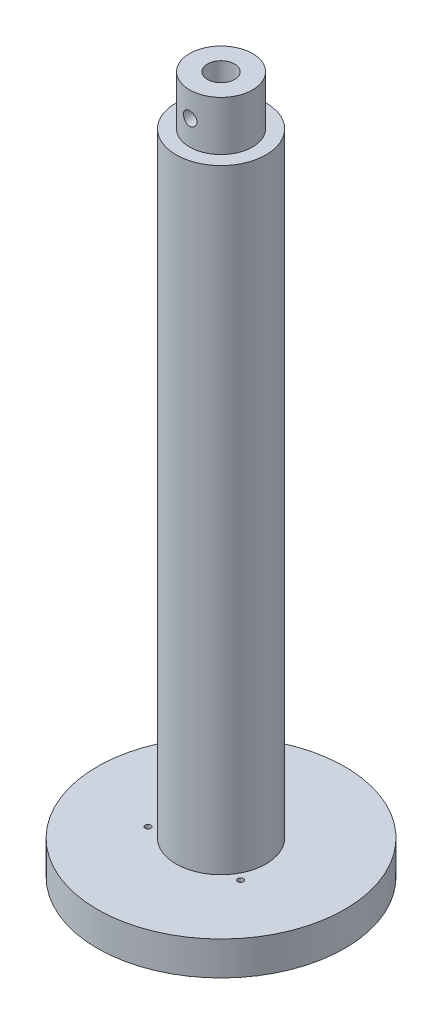
ISO-10303-21;
HEADER;
FILE_DESCRIPTION(('STEP AP214'),'2;1');
FILE_NAME('part.step','',(''),(''),'','','');
FILE_SCHEMA(('AUTOMOTIVE_DESIGN { 1 0 10303 214 1 1 1 1 }'));
ENDSEC;
DATA;
#1=APPLICATION_CONTEXT('core data for automotive mechanical design processes');
#2=APPLICATION_PROTOCOL_DEFINITION('international standard','automotive_design',2000,#1);
#3=PRODUCT_CONTEXT('',#1,'mechanical');
#4=PRODUCT('Part','Part','',(#3));
#5=PRODUCT_RELATED_PRODUCT_CATEGORY('part','',(#4));
#6=PRODUCT_DEFINITION_FORMATION('','',#4);
#7=PRODUCT_DEFINITION_CONTEXT('part definition',#1,'design');
#8=PRODUCT_DEFINITION('design','',#6,#7);
#9=PRODUCT_DEFINITION_SHAPE('','',#8);
#10=(LENGTH_UNIT() NAMED_UNIT(*) SI_UNIT(.MILLI.,.METRE.));
#11=(NAMED_UNIT(*) PLANE_ANGLE_UNIT() SI_UNIT($,.RADIAN.));
#12=(NAMED_UNIT(*) SI_UNIT($,.STERADIAN.) SOLID_ANGLE_UNIT());
#13=UNCERTAINTY_MEASURE_WITH_UNIT(LENGTH_MEASURE(1.E-05),#10,'distance_accuracy_value','');
#14=(GEOMETRIC_REPRESENTATION_CONTEXT(3) GLOBAL_UNCERTAINTY_ASSIGNED_CONTEXT((#13)) GLOBAL_UNIT_ASSIGNED_CONTEXT((#10,
#11,#12)) REPRESENTATION_CONTEXT('',''));
#15=CARTESIAN_POINT('',(0.,0.,0.));
#16=DIRECTION('',(0.,0.,1.));
#17=DIRECTION('',(1.,0.,0.));
#18=AXIS2_PLACEMENT_3D('',#15,#16,#17);
#19=CARTESIAN_POINT('',(0.,7.5,0.));
#20=DIRECTION('',(0.,-1.,0.));
#21=DIRECTION('',(0.,0.,-1.));
#22=AXIS2_PLACEMENT_3D('',#19,#20,#21);
#23=CYLINDRICAL_SURFACE('',#22,55.);
#24=CARTESIAN_POINT('',(0.,7.5,0.));
#25=DIRECTION('',(0.,1.,0.));
#26=DIRECTION('',(0.,0.,1.));
#27=AXIS2_PLACEMENT_3D('',#24,#25,#26);
#28=CIRCLE('',#27,55.);
#29=CARTESIAN_POINT('',(0.,7.5,55.));
#30=VERTEX_POINT('',#29);
#31=EDGE_CURVE('E133',#30,#30,#28,.T.);
#32=ORIENTED_EDGE('',*,*,#31,.F.);
#33=EDGE_LOOP('',(#32));
#34=FACE_BOUND('',#33,.T.);
#35=CARTESIAN_POINT('',(0.,-7.5,0.));
#36=DIRECTION('',(0.,1.,0.));
#37=DIRECTION('',(0.,0.,1.));
#38=AXIS2_PLACEMENT_3D('',#35,#36,#37);
#39=CIRCLE('',#38,55.);
#40=CARTESIAN_POINT('',(0.,-7.5,55.));
#41=VERTEX_POINT('',#40);
#42=EDGE_CURVE('E135',#41,#41,#39,.T.);
#43=ORIENTED_EDGE('',*,*,#42,.T.);
#44=EDGE_LOOP('',(#43));
#45=FACE_BOUND('',#44,.T.);
#46=ADVANCED_FACE('F44',(#34,#45),#23,.T.);
#47=CARTESIAN_POINT('',(0.,7.5,0.));
#48=DIRECTION('',(0.,1.,0.));
#49=DIRECTION('',(0.,0.,1.));
#50=AXIS2_PLACEMENT_3D('',#47,#48,#49);
#51=PLANE('',#50);
#52=CARTESIAN_POINT('',(-20.5681033398804,7.5,11.8750000000001));
#53=DIRECTION('',(0.,1.,0.));
#54=DIRECTION('',(0.,0.,1.));
#55=AXIS2_PLACEMENT_3D('',#52,#53,#54);
#56=CIRCLE('',#55,1.24999999999999);
#57=CARTESIAN_POINT('',(-20.5681033398804,7.5,13.1250000000001));
#58=VERTEX_POINT('',#57);
#59=EDGE_CURVE('E76',#58,#58,#56,.T.);
#60=ORIENTED_EDGE('',*,*,#59,.F.);
#61=EDGE_LOOP('',(#60));
#62=FACE_BOUND('',#61,.T.);
#63=CARTESIAN_POINT('',(20.5681033398804,7.5,11.8750000000001));
#64=DIRECTION('',(0.,1.,0.));
#65=DIRECTION('',(0.,0.,1.));
#66=AXIS2_PLACEMENT_3D('',#63,#64,#65);
#67=CIRCLE('',#66,1.24999999999999);
#68=CARTESIAN_POINT('',(20.5681033398804,7.5,13.1250000000001));
#69=VERTEX_POINT('',#68);
#70=EDGE_CURVE('E80',#69,#69,#67,.T.);
#71=ORIENTED_EDGE('',*,*,#70,.F.);
#72=EDGE_LOOP('',(#71));
#73=FACE_BOUND('',#72,.T.);
#74=CARTESIAN_POINT('',(0.,7.5,-23.75));
#75=DIRECTION('',(0.,1.,0.));
#76=DIRECTION('',(0.,0.,1.));
#77=AXIS2_PLACEMENT_3D('',#74,#75,#76);
#78=CIRCLE('',#77,1.24999999999999);
#79=CARTESIAN_POINT('',(0.,7.5,-22.5));
#80=VERTEX_POINT('',#79);
#81=EDGE_CURVE('E88',#80,#80,#78,.T.);
#82=ORIENTED_EDGE('',*,*,#81,.F.);
#83=EDGE_LOOP('',(#82));
#84=FACE_BOUND('',#83,.T.);
#85=CARTESIAN_POINT('',(0.,7.5,0.));
#86=DIRECTION('',(0.,1.,0.));
#87=DIRECTION('',(0.,0.,1.));
#88=AXIS2_PLACEMENT_3D('',#85,#86,#87);
#89=CIRCLE('',#88,20.);
#90=CARTESIAN_POINT('',(0.,7.5,20.));
#91=VERTEX_POINT('',#90);
#92=EDGE_CURVE('E59',#91,#91,#89,.T.);
#93=ORIENTED_EDGE('',*,*,#92,.F.);
#94=EDGE_LOOP('',(#93));
#95=FACE_BOUND('',#94,.T.);
#96=ORIENTED_EDGE('',*,*,#31,.T.);
#97=EDGE_LOOP('',(#96));
#98=FACE_BOUND('',#97,.T.);
#99=ADVANCED_FACE('F183',(#62,#73,#84,#95,#98),#51,.T.);
#100=CARTESIAN_POINT('',(0.,-7.5,0.));
#101=DIRECTION('',(0.,1.,0.));
#102=DIRECTION('',(0.,0.,1.));
#103=AXIS2_PLACEMENT_3D('',#100,#101,#102);
#104=PLANE('',#103);
#105=CARTESIAN_POINT('',(0.,-7.5,0.));
#106=DIRECTION('',(0.,-1.,0.));
#107=DIRECTION('',(0.,0.,-1.));
#108=AXIS2_PLACEMENT_3D('',#105,#106,#107);
#109=CIRCLE('',#108,53.);
#110=CARTESIAN_POINT('',(0.,-7.5,-53.));
#111=VERTEX_POINT('',#110);
#112=EDGE_CURVE('E147',#111,#111,#109,.T.);
#113=ORIENTED_EDGE('',*,*,#112,.F.);
#114=EDGE_LOOP('',(#113));
#115=FACE_BOUND('',#114,.T.);
#116=ORIENTED_EDGE('',*,*,#42,.F.);
#117=EDGE_LOOP('',(#116));
#118=FACE_BOUND('',#117,.T.);
#119=ADVANCED_FACE('F179',(#115,#118),#104,.F.);
#120=CARTESIAN_POINT('',(0.,280.5,0.));
#121=DIRECTION('',(0.,-1.,0.));
#122=DIRECTION('',(0.,0.,-1.));
#123=AXIS2_PLACEMENT_3D('',#120,#121,#122);
#124=CYLINDRICAL_SURFACE('',#123,20.);
#125=CARTESIAN_POINT('',(0.,280.5,0.));
#126=DIRECTION('',(0.,1.,0.));
#127=DIRECTION('',(0.,0.,1.));
#128=AXIS2_PLACEMENT_3D('',#125,#126,#127);
#129=CIRCLE('',#128,20.);
#130=CARTESIAN_POINT('',(0.,280.5,20.));
#131=VERTEX_POINT('',#130);
#132=EDGE_CURVE('E137',#131,#131,#129,.T.);
#133=ORIENTED_EDGE('',*,*,#132,.F.);
#134=EDGE_LOOP('',(#133));
#135=FACE_BOUND('',#134,.T.);
#136=ORIENTED_EDGE('',*,*,#92,.T.);
#137=EDGE_LOOP('',(#136));
#138=FACE_BOUND('',#137,.T.);
#139=ADVANCED_FACE('F176',(#135,#138),#124,.T.);
#140=CARTESIAN_POINT('',(0.,280.5,0.));
#141=DIRECTION('',(0.,1.,0.));
#142=DIRECTION('',(0.,0.,1.));
#143=AXIS2_PLACEMENT_3D('',#140,#141,#142);
#144=PLANE('',#143);
#145=CARTESIAN_POINT('',(0.,280.5,0.));
#146=DIRECTION('',(0.,1.,0.));
#147=DIRECTION('',(0.,0.,1.));
#148=AXIS2_PLACEMENT_3D('',#145,#146,#147);
#149=CIRCLE('',#148,14.);
#150=CARTESIAN_POINT('',(0.,280.5,14.));
#151=VERTEX_POINT('',#150);
#152=EDGE_CURVE('E11',#151,#151,#149,.T.);
#153=ORIENTED_EDGE('',*,*,#152,.F.);
#154=EDGE_LOOP('',(#153));
#155=FACE_BOUND('',#154,.T.);
#156=ORIENTED_EDGE('',*,*,#132,.T.);
#157=EDGE_LOOP('',(#156));
#158=FACE_BOUND('',#157,.T.);
#159=ADVANCED_FACE('F197',(#155,#158),#144,.T.);
#160=CARTESIAN_POINT('',(0.,302.5,0.));
#161=DIRECTION('',(0.,-1.,0.));
#162=DIRECTION('',(0.,0.,-1.));
#163=AXIS2_PLACEMENT_3D('',#160,#161,#162);
#164=CYLINDRICAL_SURFACE('',#163,14.);
#165=CARTESIAN_POINT('',(0.,294.5,-14.));
#166=CARTESIAN_POINT('',(-0.166471772181232,294.499994200851,-13.9999969208645));
#167=CARTESIAN_POINT('',(-0.333014391200546,294.486096783224,-13.9970005189942));
#168=CARTESIAN_POINT('',(-0.66137468858665,294.430928686293,-13.9853365965546));
#169=CARTESIAN_POINT('',(-0.823188807142375,294.38963791161,-13.976664912742));
#170=CARTESIAN_POINT('',(-1.13729864763547,294.281031270784,-13.9546166357765));
#171=CARTESIAN_POINT('',(-1.28960392689311,294.213742041237,-13.9412448593434));
#172=CARTESIAN_POINT('',(-1.58075635592158,294.055131827658,-13.9112421363594));
#173=CARTESIAN_POINT('',(-1.71960396349475,293.9638116615,-13.8946113007332));
#174=CARTESIAN_POINT('',(-1.98204958107046,293.758239400653,-13.8596273849262));
#175=CARTESIAN_POINT('',(-2.10541006838889,293.643687556203,-13.8412536628652));
#176=CARTESIAN_POINT('',(-2.33132084778868,293.39554736863,-13.8050013962829));
#177=CARTESIAN_POINT('',(-2.43386934301816,293.261957383498,-13.7871228946326));
#178=CARTESIAN_POINT('',(-2.61628408759616,292.977788494279,-13.7536823209445));
#179=CARTESIAN_POINT('',(-2.69589916670015,292.827044964488,-13.7381467268872));
#180=CARTESIAN_POINT('',(-2.82857647382292,292.513931092466,-13.7114465111707));
#181=CARTESIAN_POINT('',(-2.8816417400343,292.351562083015,-13.7002813894142));
#182=CARTESIAN_POINT('',(-2.95893148844909,292.022377826824,-13.6837961785262));
#183=CARTESIAN_POINT('',(-2.98357559496685,291.855665448672,-13.6783911379297));
#184=CARTESIAN_POINT('',(-3.00462790413154,291.520391534986,-13.6737827969021));
#185=CARTESIAN_POINT('',(-3.00103943329259,291.35183021964,-13.6745787658346));
#186=CARTESIAN_POINT('',(-2.96606652681722,291.020750624132,-13.6822055320766));
#187=CARTESIAN_POINT('',(-2.93516797298816,290.8581782218,-13.6889308336432));
#188=CARTESIAN_POINT('',(-2.84722108597352,290.540579519421,-13.7074918675158));
#189=CARTESIAN_POINT('',(-2.7901713387293,290.385553627935,-13.719327876168));
#190=CARTESIAN_POINT('',(-2.65109102151982,290.086074254253,-13.7468816151145));
#191=CARTESIAN_POINT('',(-2.5688722194566,289.941710974575,-13.7626284196673));
#192=CARTESIAN_POINT('',(-2.38192014567987,289.668649670084,-13.7962114500258));
#193=CARTESIAN_POINT('',(-2.27718392207125,289.539953702628,-13.8140479496379));
#194=CARTESIAN_POINT('',(-2.04559085510641,289.299081288653,-13.8502543678776));
#195=CARTESIAN_POINT('',(-1.91832046792881,289.187302586831,-13.8686276794436));
#196=CARTESIAN_POINT('',(-1.64663461253818,288.986612532621,-13.9035003499412));
#197=CARTESIAN_POINT('',(-1.50221885755079,288.897701562799,-13.9199996775194));
#198=CARTESIAN_POINT('',(-1.19986692409991,288.745178640186,-13.9493155706801));
#199=CARTESIAN_POINT('',(-1.04190451772695,288.681617174844,-13.9621247728671));
#200=CARTESIAN_POINT('',(-0.717206293371412,288.582048703358,-13.9825621849067));
#201=CARTESIAN_POINT('',(-0.550471702267347,288.546037854873,-13.9901911172077));
#202=CARTESIAN_POINT('',(-0.216375341673274,288.503167571713,-13.9993061269562));
#203=CARTESIAN_POINT('',(-0.0490863545432417,288.495764574236,-14.0009067304213));
#204=CARTESIAN_POINT('',(0.284337947300799,288.50884914225,-13.9981049787194));
#205=CARTESIAN_POINT('',(0.450473336254499,288.529334895926,-13.993703013514));
#206=CARTESIAN_POINT('',(0.775085075965599,288.597164487323,-13.9794628609053));
#207=CARTESIAN_POINT('',(0.933623425816941,288.644224738945,-13.9696821009092));
#208=CARTESIAN_POINT('',(1.24055690094682,288.76355388599,-13.9457784884302));
#209=CARTESIAN_POINT('',(1.38895118517546,288.835824868623,-13.9316552764447));
#210=CARTESIAN_POINT('',(1.67364279592949,289.004667086121,-13.900350087808));
#211=CARTESIAN_POINT('',(1.80974515022227,289.101559589819,-13.8831286270855));
#212=CARTESIAN_POINT('',(2.06395385104719,289.316469649778,-13.8476206606969));
#213=CARTESIAN_POINT('',(2.18205795738399,289.434489831775,-13.8293340228419));
#214=CARTESIAN_POINT('',(2.39905422115977,289.690794740374,-13.7933634541265));
#215=CARTESIAN_POINT('',(2.49757074510311,289.829400198444,-13.7756958444257));
#216=CARTESIAN_POINT('',(2.66992830772078,290.121509192956,-13.7433330911936));
#217=CARTESIAN_POINT('',(2.74377039827409,290.275012093955,-13.7286378209611));
#218=CARTESIAN_POINT('',(2.86419482497094,290.591744597989,-13.7040201961478));
#219=CARTESIAN_POINT('',(2.91092797282549,290.754914712861,-13.6940714916593));
#220=CARTESIAN_POINT('',(2.9762539217067,291.087031167667,-13.6800237341684));
#221=CARTESIAN_POINT('',(2.99485101560515,291.255976622403,-13.6759237887941));
#222=CARTESIAN_POINT('',(3.00319999852081,291.59106468635,-13.6740923769631));
#223=CARTESIAN_POINT('',(2.99354694516623,291.757192029961,-13.6762295303709));
#224=CARTESIAN_POINT('',(2.94699578812661,292.085394484265,-13.6863352636966));
#225=CARTESIAN_POINT('',(2.91009797915958,292.247469638773,-13.6943037805343));
#226=CARTESIAN_POINT('',(2.81038691880867,292.562517315738,-13.7151116220831));
#227=CARTESIAN_POINT('',(2.74765694341773,292.715517297329,-13.7279352844941));
#228=CARTESIAN_POINT('',(2.598135031912,293.008910745014,-13.757015291813));
#229=CARTESIAN_POINT('',(2.51134070602998,293.14930295723,-13.7732719776073));
#230=CARTESIAN_POINT('',(2.31416580698606,293.416436387451,-13.8077811118646));
#231=CARTESIAN_POINT('',(2.20335974842472,293.542859391894,-13.8260661987785));
#232=CARTESIAN_POINT('',(1.96217310923923,293.775512525041,-13.8623489959939));
#233=CARTESIAN_POINT('',(1.83178801877118,293.881737988624,-13.8803466390259));
#234=CARTESIAN_POINT('',(1.55320629453742,294.072231919011,-13.9142898209797));
#235=CARTESIAN_POINT('',(1.40480969201927,294.156213212462,-13.9302072914125));
#236=CARTESIAN_POINT('',(1.09570032188119,294.297909057812,-13.9579165220804));
#237=CARTESIAN_POINT('',(0.934998211727771,294.35564604517,-13.9697118042468));
#238=CARTESIAN_POINT('',(0.645070435106434,294.432704370262,-13.9856969692354));
#239=CARTESIAN_POINT('',(0.517434411091981,294.45789286796,-13.9910278377653));
#240=CARTESIAN_POINT('',(0.259879921707706,294.491542603423,-13.9981804830944));
#241=CARTESIAN_POINT('',(0.129961550177496,294.500004527292,-14.0000024038263));
#242=CARTESIAN_POINT('',(0.,294.5,-14.));
#243=B_SPLINE_CURVE_WITH_KNOTS('',3,(#165,#166,#167,#168,#169,#170,#171,#172,#173,#174,#175,
#176,#177,#178,#179,#180,#181,#182,#183,#184,#185,#186,#187,#188,#189,#190,#191,#192,#193,#194,
#195,#196,#197,#198,#199,#200,#201,#202,#203,#204,#205,#206,#207,#208,#209,#210,#211,#212,#213,
#214,#215,#216,#217,#218,#219,#220,#221,#222,#223,#224,#225,#226,#227,#228,#229,#230,#231,#232,
#233,#234,#235,#236,#237,#238,#239,#240,#241,#242),.UNSPECIFIED.,.T.,.F.,(4,2,2,2,2,2,2,2,2,2,2,
2,2,2,2,2,2,2,2,2,2,2,2,2,2,2,2,2,2,2,2,2,2,2,2,2,2,2,4),(0.,0.498939673024156,
0.998245766439869,1.49704164885122,1.99582055729179,2.50149923763463,3.00722155837009,
3.51828858429018,4.02929711354974,4.53266016249332,5.03596390338332,5.5304895090586,
6.02504185809137,6.52338712331933,7.02179775841777,7.53054022100584,8.03929119404704,
8.54905042279612,9.05873854512685,9.55869331408369,10.0586156046286,10.5533012117853,
11.0480277839687,11.549574677356,12.0511839460897,12.5616412656707,13.0720768215161,
13.5796448081695,14.0871353445837,14.5840136108059,15.0808865021654,15.5761699941357,
16.0715026890325,16.5764590030823,17.0815318079423,17.5928382071445,18.1037066802054,
18.4932359826459,18.8827493067467),.UNSPECIFIED.);
#244=CARTESIAN_POINT('',(0.,294.5,-14.));
#245=VERTEX_POINT('',#244);
#246=EDGE_CURVE('E105',#245,#245,#243,.T.);
#247=ORIENTED_EDGE('',*,*,#246,.T.);
#248=EDGE_LOOP('',(#247));
#249=FACE_BOUND('',#248,.T.);
#250=CARTESIAN_POINT('',(3.,291.5,13.6747943311773));
#251=CARTESIAN_POINT('',(2.99999416477353,291.333577695034,13.6747976912119));
#252=CARTESIAN_POINT('',(2.9861047248957,291.167084452115,13.6778654468474));
#253=CARTESIAN_POINT('',(2.93097118505966,290.838826655517,13.6897835685885));
#254=CARTESIAN_POINT('',(2.88970679307235,290.677065702648,13.6986382242345));
#255=CARTESIAN_POINT('',(2.78117727369209,290.363068500852,13.7210823058705));
#256=CARTESIAN_POINT('',(2.71394001982634,290.210822243757,13.7346666545171));
#257=CARTESIAN_POINT('',(2.55545235346682,289.919769452111,13.7650334169722));
#258=CARTESIAN_POINT('',(2.46420264097553,289.780962525942,13.7818157375507));
#259=CARTESIAN_POINT('',(2.25870285140444,289.518474077036,13.8169915759332));
#260=CARTESIAN_POINT('',(2.14413718967967,289.39504224752,13.8354049974351));
#261=CARTESIAN_POINT('',(1.89593901625918,289.168992891188,13.8715938342079));
#262=CARTESIAN_POINT('',(1.76230506043539,289.06637694228,13.8893692010283));
#263=CARTESIAN_POINT('',(1.47809457692922,288.883889111017,13.9224953821886));
#264=CARTESIAN_POINT('',(1.32736097645996,288.804256688459,13.9378199763886));
#265=CARTESIAN_POINT('',(1.01426853868524,288.671544617107,13.9640934208587));
#266=CARTESIAN_POINT('',(0.851910954760668,288.618462110428,13.9750427420666));
#267=CARTESIAN_POINT('',(0.522774375343057,288.541140058137,13.9911913056236));
#268=CARTESIAN_POINT('',(0.356098801193879,288.516478142895,13.9964746675677));
#269=CARTESIAN_POINT('',(0.0208978906133176,288.495377445373,14.00098724414));
#270=CARTESIAN_POINT('',(-0.147627240329493,288.498935558878,14.000217124654));
#271=CARTESIAN_POINT('',(-0.478834058500997,288.533857929327,13.9927740172512));
#272=CARTESIAN_POINT('',(-0.641566230724195,288.56476700058,13.9861976630486));
#273=CARTESIAN_POINT('',(-0.95947892795675,288.652789363704,13.9679908317821));
#274=CARTESIAN_POINT('',(-1.11465912035009,288.7099038086,13.9563601323304));
#275=CARTESIAN_POINT('',(-1.41433499511308,288.849122917777,13.9291950929372));
#276=CARTESIAN_POINT('',(-1.55874731403155,288.931401534409,13.9136337160789));
#277=CARTESIAN_POINT('',(-1.83188185312567,289.118483936327,13.8803158748773));
#278=CARTESIAN_POINT('',(-1.96060201290305,289.223290674601,13.8625591228939));
#279=CARTESIAN_POINT('',(-2.20140417600395,289.454937089056,13.8263865292185));
#280=CARTESIAN_POINT('',(-2.31310234640499,289.582175158714,13.8079646074571));
#281=CARTESIAN_POINT('',(-2.51364486469454,289.853766570137,13.7728713366395));
#282=CARTESIAN_POINT('',(-2.60248864236135,289.998120338811,13.7562000312677));
#283=CARTESIAN_POINT('',(-2.75496155146593,290.300449002128,13.7264804717345));
#284=CARTESIAN_POINT('',(-2.81852070177846,290.458460247705,13.7134423025555));
#285=CARTESIAN_POINT('',(-2.91806990318232,290.783265531893,13.6926068161323));
#286=CARTESIAN_POINT('',(-2.95406413389256,290.950058234886,13.6848087043697));
#287=CARTESIAN_POINT('',(-2.99687172049304,291.284191505299,13.6754976251089));
#288=CARTESIAN_POINT('',(-3.0042428385728,291.451457350155,13.673864541034));
#289=CARTESIAN_POINT('',(-2.99110279284747,291.784827986363,13.6767447914799));
#290=CARTESIAN_POINT('',(-2.97059346163271,291.950932853307,13.6812577220213));
#291=CARTESIAN_POINT('',(-2.90275789271169,292.275340869961,13.6958083096841));
#292=CARTESIAN_POINT('',(-2.85573660503108,292.433710865194,13.7057831054873));
#293=CARTESIAN_POINT('',(-2.736541058935,292.740324675066,13.7300771973955));
#294=CARTESIAN_POINT('',(-2.66436447325637,292.888567551268,13.744396895457));
#295=CARTESIAN_POINT('',(-2.4956700883341,293.173139369518,13.7760326816069));
#296=CARTESIAN_POINT('',(-2.39880737181584,293.309259164024,13.7933900349263));
#297=CARTESIAN_POINT('',(-2.18394367667201,293.563516691748,13.8290355072028));
#298=CARTESIAN_POINT('',(-2.06594018364322,293.681652282897,13.8473237366892));
#299=CARTESIAN_POINT('',(-1.80962552884164,293.898740605889,13.8831647998035));
#300=CARTESIAN_POINT('',(-1.67098985165756,293.997313832314,13.9006987121549));
#301=CARTESIAN_POINT('',(-1.37880296256457,294.169770818702,13.932712214298));
#302=CARTESIAN_POINT('',(-1.2252524320875,294.243655705946,13.9471919435339));
#303=CARTESIAN_POINT('',(-0.908530837964101,294.364104109277,13.9713855676315));
#304=CARTESIAN_POINT('',(-0.745426386150369,294.410836607493,13.9811288760739));
#305=CARTESIAN_POINT('',(-0.413450354006604,294.476183411465,13.9948787860397));
#306=CARTESIAN_POINT('',(-0.244579579948009,294.494801631948,13.9988861862461));
#307=CARTESIAN_POINT('',(0.0905274341056192,294.503221304824,14.000690220181));
#308=CARTESIAN_POINT('',(0.256749011018401,294.493590317209,13.9986091800327));
#309=CARTESIAN_POINT('',(0.585145876831924,294.447050472962,13.9887310472683));
#310=CARTESIAN_POINT('',(0.747321232810652,294.410142068843,13.9809340494761));
#311=CARTESIAN_POINT('',(1.06260389697441,294.310362387501,13.9605077727683));
#312=CARTESIAN_POINT('',(1.21573673014593,294.24756862123,13.9478929286009));
#313=CARTESIAN_POINT('',(1.5093699134468,294.097877457661,13.9191807210222));
#314=CARTESIAN_POINT('',(1.64986908959372,294.010977823385,13.9030830344402));
#315=CARTESIAN_POINT('',(1.91702461378897,293.813675362517,13.8687961986559));
#316=CARTESIAN_POINT('',(2.0433807302059,293.702871683367,13.8505741780296));
#317=CARTESIAN_POINT('',(2.27590002915843,293.46171877949,13.8142738016446));
#318=CARTESIAN_POINT('',(2.38205836126938,293.331364873252,13.7961954813913));
#319=CARTESIAN_POINT('',(2.57246523191559,293.052819013661,13.761973872554));
#320=CARTESIAN_POINT('',(2.65641795611842,292.904421283555,13.7458581173137));
#321=CARTESIAN_POINT('',(2.79806009312271,292.595312558283,13.7177299427787));
#322=CARTESIAN_POINT('',(2.8557721284606,292.434612309528,13.7057139912142));
#323=CARTESIAN_POINT('',(2.93277214244341,292.144747737608,13.6894112131582));
#324=CARTESIAN_POINT('',(2.95793505015818,292.017176648579,13.683965661845));
#325=CARTESIAN_POINT('',(2.99155088086543,291.759751376851,13.6766559900021));
#326=CARTESIAN_POINT('',(3.00000455455863,291.629897296985,13.6747917085757));
#327=CARTESIAN_POINT('',(3.,291.5,13.6747943311773));
#328=B_SPLINE_CURVE_WITH_KNOTS('',3,(#250,#251,#252,#253,#254,#255,#256,#257,#258,#259,#260,
#261,#262,#263,#264,#265,#266,#267,#268,#269,#270,#271,#272,#273,#274,#275,#276,#277,#278,#279,
#280,#281,#282,#283,#284,#285,#286,#287,#288,#289,#290,#291,#292,#293,#294,#295,#296,#297,#298,
#299,#300,#301,#302,#303,#304,#305,#306,#307,#308,#309,#310,#311,#312,#313,#314,#315,#316,#317,
#318,#319,#320,#321,#322,#323,#324,#325,#326,#327),.UNSPECIFIED.,.T.,.F.,(4,2,2,2,2,2,2,2,2,2,2,
2,2,2,2,2,2,2,2,2,2,2,2,2,2,2,2,2,2,2,2,2,2,2,2,2,2,2,4),(0.,0.498790964054998,
0.997952076959905,1.49657898230546,1.99519135347055,2.50106459165384,3.00697616225751,
3.51798269640551,4.02893421292531,4.53219016303855,5.03539075554479,5.53037115334741,
6.02537333215165,6.52387776286873,7.02244757744625,7.53097921558586,8.03952354046184,
8.54946574823562,9.05933061907676,9.55920866385043,10.0590538530783,10.5532636149874,
11.047519111263,11.5491002043263,12.0507409931815,12.5613242936642,13.0718842775108,
13.5792317964875,14.0865086641707,14.5836639928825,15.080811074302,15.5764801923896,
16.0721953230272,16.5769782832192,17.0818823126246,17.5932076033629,18.1040912322742,
18.4934291224858,18.8827495204009),.UNSPECIFIED.);
#329=CARTESIAN_POINT('',(3.,291.5,13.6747943311773));
#330=VERTEX_POINT('',#329);
#331=EDGE_CURVE('E97',#330,#330,#328,.T.);
#332=ORIENTED_EDGE('',*,*,#331,.T.);
#333=EDGE_LOOP('',(#332));
#334=FACE_BOUND('',#333,.T.);
#335=CARTESIAN_POINT('',(0.,302.5,0.));
#336=DIRECTION('',(0.,1.,0.));
#337=DIRECTION('',(0.,0.,1.));
#338=AXIS2_PLACEMENT_3D('',#335,#336,#337);
#339=CIRCLE('',#338,14.);
#340=CARTESIAN_POINT('',(0.,302.5,14.));
#341=VERTEX_POINT('',#340);
#342=EDGE_CURVE('E145',#341,#341,#339,.T.);
#343=ORIENTED_EDGE('',*,*,#342,.F.);
#344=EDGE_LOOP('',(#343));
#345=FACE_BOUND('',#344,.T.);
#346=ORIENTED_EDGE('',*,*,#152,.T.);
#347=EDGE_LOOP('',(#346));
#348=FACE_BOUND('',#347,.T.);
#349=ADVANCED_FACE('F110',(#249,#334,#345,#348),#164,.T.);
#350=CARTESIAN_POINT('',(0.,302.5,0.));
#351=DIRECTION('',(0.,1.,0.));
#352=DIRECTION('',(0.,0.,1.));
#353=AXIS2_PLACEMENT_3D('',#350,#351,#352);
#354=PLANE('',#353);
#355=CARTESIAN_POINT('',(0.,302.5,0.));
#356=DIRECTION('',(0.,-1.,0.));
#357=DIRECTION('',(0.,0.,-1.));
#358=AXIS2_PLACEMENT_3D('',#355,#356,#357);
#359=CIRCLE('',#358,6.);
#360=CARTESIAN_POINT('',(0.,302.5,-6.));
#361=VERTEX_POINT('',#360);
#362=EDGE_CURVE('E150',#361,#361,#359,.T.);
#363=ORIENTED_EDGE('',*,*,#362,.T.);
#364=EDGE_LOOP('',(#363));
#365=FACE_BOUND('',#364,.T.);
#366=ORIENTED_EDGE('',*,*,#342,.T.);
#367=EDGE_LOOP('',(#366));
#368=FACE_BOUND('',#367,.T.);
#369=ADVANCED_FACE('F156',(#365,#368),#354,.T.);
#370=CARTESIAN_POINT('',(0.,-4.5,0.));
#371=DIRECTION('',(0.,-1.,0.));
#372=DIRECTION('',(0.,0.,-1.));
#373=AXIS2_PLACEMENT_3D('',#370,#371,#372);
#374=CYLINDRICAL_SURFACE('',#373,53.);
#375=CARTESIAN_POINT('',(0.,-4.5,0.));
#376=DIRECTION('',(0.,-1.,0.));
#377=DIRECTION('',(0.,0.,-1.));
#378=AXIS2_PLACEMENT_3D('',#375,#376,#377);
#379=CIRCLE('',#378,53.);
#380=CARTESIAN_POINT('',(0.,-4.5,-53.));
#381=VERTEX_POINT('',#380);
#382=EDGE_CURVE('E146',#381,#381,#379,.T.);
#383=ORIENTED_EDGE('',*,*,#382,.F.);
#384=EDGE_LOOP('',(#383));
#385=FACE_BOUND('',#384,.T.);
#386=ORIENTED_EDGE('',*,*,#112,.T.);
#387=EDGE_LOOP('',(#386));
#388=FACE_BOUND('',#387,.T.);
#389=ADVANCED_FACE('F167',(#385,#388),#374,.F.);
#390=CARTESIAN_POINT('',(0.,-4.5,0.));
#391=DIRECTION('',(0.,-1.,0.));
#392=DIRECTION('',(0.,0.,-1.));
#393=AXIS2_PLACEMENT_3D('',#390,#391,#392);
#394=PLANE('',#393);
#395=CARTESIAN_POINT('',(0.,-4.5,0.));
#396=DIRECTION('',(0.,-1.,0.));
#397=DIRECTION('',(0.,0.,-1.));
#398=AXIS2_PLACEMENT_3D('',#395,#396,#397);
#399=CIRCLE('',#398,6.);
#400=CARTESIAN_POINT('',(0.,-4.5,-6.));
#401=VERTEX_POINT('',#400);
#402=EDGE_CURVE('E152',#401,#401,#399,.T.);
#403=ORIENTED_EDGE('',*,*,#402,.F.);
#404=EDGE_LOOP('',(#403));
#405=FACE_BOUND('',#404,.T.);
#406=ORIENTED_EDGE('',*,*,#382,.T.);
#407=EDGE_LOOP('',(#406));
#408=FACE_BOUND('',#407,.T.);
#409=ADVANCED_FACE('F164',(#405,#408),#394,.T.);
#410=CARTESIAN_POINT('',(0.,302.5,0.));
#411=DIRECTION('',(0.,-1.,0.));
#412=DIRECTION('',(0.,0.,-1.));
#413=AXIS2_PLACEMENT_3D('',#410,#411,#412);
#414=CYLINDRICAL_SURFACE('',#413,6.);
#415=CARTESIAN_POINT('',(0.,294.5,-6.));
#416=CARTESIAN_POINT('',(0.0788941476270897,294.499999161259,-5.99999934964153));
#417=CARTESIAN_POINT('',(0.15779662040795,294.496882054525,-5.99843869002385));
#418=CARTESIAN_POINT('',(0.315001991255921,294.48446072826,-5.99224358793258));
#419=CARTESIAN_POINT('',(0.393304603620532,294.475153725935,-5.98760776295702));
#420=CARTESIAN_POINT('',(0.626628691373734,294.438042143181,-5.96921978027472));
#421=CARTESIAN_POINT('',(0.779952894844979,294.401047170937,-5.95098734455496));
#422=CARTESIAN_POINT('',(1.07683586335996,294.304418225571,-5.90448966743082));
#423=CARTESIAN_POINT('',(1.22043005484384,294.244872233792,-5.87626344365679));
#424=CARTESIAN_POINT('',(1.49540820515374,294.105288749321,-5.81237302716334));
#425=CARTESIAN_POINT('',(1.62679312559147,294.025252872297,-5.77670942093695));
#426=CARTESIAN_POINT('',(1.88252701271776,293.841446019151,-5.69868752298932));
#427=CARTESIAN_POINT('',(2.00596945416847,293.736532052479,-5.65605474586615));
#428=CARTESIAN_POINT('',(2.23433451090183,293.508444078513,-5.56980033629331));
#429=CARTESIAN_POINT('',(2.33924301355729,293.385256286835,-5.5261779786051));
#430=CARTESIAN_POINT('',(2.53576864722248,293.112515639918,-5.43896347969577));
#431=CARTESIAN_POINT('',(2.62572411176599,292.961659025542,-5.3956360268673));
#432=CARTESIAN_POINT('',(2.74034031450289,292.724049145977,-5.33782449719395));
#433=CARTESIAN_POINT('',(2.77516786882117,292.642929075437,-5.31974570840246));
#434=CARTESIAN_POINT('',(2.83769299596484,292.47739942012,-5.28665768365287));
#435=CARTESIAN_POINT('',(2.86539478083936,292.392991812742,-5.27164663543394));
#436=CARTESIAN_POINT('',(2.91188280266505,292.226604203238,-5.24610341708083));
#437=CARTESIAN_POINT('',(2.93110042292907,292.144777203244,-5.23535838565202));
#438=CARTESIAN_POINT('',(2.96263559384681,291.97944509148,-5.21757784151145));
#439=CARTESIAN_POINT('',(2.9749568053511,291.895940894459,-5.21054036082126));
#440=CARTESIAN_POINT('',(2.99251382412705,291.727993632584,-5.20047756645272));
#441=CARTESIAN_POINT('',(2.99775389857938,291.643551164106,-5.19744983647106));
#442=CARTESIAN_POINT('',(3.00108452416055,291.474506345659,-5.19552555967191));
#443=CARTESIAN_POINT('',(2.99917575741611,291.389904011712,-5.19662861870362));
#444=CARTESIAN_POINT('',(2.98404973540404,291.157246101678,-5.20534668059274));
#445=CARTESIAN_POINT('',(2.96335042632723,291.009755845846,-5.21726794353739));
#446=CARTESIAN_POINT('',(2.90082280036693,290.720806323175,-5.25228182412118));
#447=CARTESIAN_POINT('',(2.85898775295595,290.579348993049,-5.2753780002338));
#448=CARTESIAN_POINT('',(2.75462843937304,290.302320349703,-5.33062568888728));
#449=CARTESIAN_POINT('',(2.69164495870315,290.166962888249,-5.36297559567996));
#450=CARTESIAN_POINT('',(2.54712530575798,289.908095036686,-5.43310175251307));
#451=CARTESIAN_POINT('',(2.46558080007523,289.78459000352,-5.47088043711311));
#452=CARTESIAN_POINT('',(2.27419808739747,289.53643690622,-5.55339485686876));
#453=CARTESIAN_POINT('',(2.16208335434886,289.413629557616,-5.59840533924978));
#454=CARTESIAN_POINT('',(1.91866675699302,289.187793565798,-5.68642866684949));
#455=CARTESIAN_POINT('',(1.7873557754036,289.084774375094,-5.72944054996685));
#456=CARTESIAN_POINT('',(1.50154951155103,288.896943067981,-5.81105962769461));
#457=CARTESIAN_POINT('',(1.34626077321062,288.813198596303,-5.84936952731879));
#458=CARTESIAN_POINT('',(1.02139864805279,288.673708899242,-5.91473643118064));
#459=CARTESIAN_POINT('',(0.851836729203721,288.61794144145,-5.94180236767507));
#460=CARTESIAN_POINT('',(0.518299474608071,288.540573792064,-5.97973001282227));
#461=CARTESIAN_POINT('',(0.355024591545146,288.516526293618,-5.99174814919366));
#462=CARTESIAN_POINT('',(0.0263387999478947,288.495605805738,-6.00219040361882));
#463=CARTESIAN_POINT('',(-0.139071059584252,288.498719942861,-6.00062096160122));
#464=CARTESIAN_POINT('',(-0.453698915981432,288.53062006546,-5.98473576763842));
#465=CARTESIAN_POINT('',(-0.603178224155128,288.557397598244,-5.97141737064974));
#466=CARTESIAN_POINT('',(-0.895220676900459,288.632714215631,-5.93466513944052));
#467=CARTESIAN_POINT('',(-1.03778305707533,288.681255699349,-5.91123019004896));
#468=CARTESIAN_POINT('',(-1.31666582534656,288.799995399311,-5.85552754239056));
#469=CARTESIAN_POINT('',(-1.45269119100304,288.870773150341,-5.82302645301466));
#470=CARTESIAN_POINT('',(-1.71138408511219,289.031322606947,-5.75231922959683));
#471=CARTESIAN_POINT('',(-1.83404588938514,289.121102403829,-5.71411066728832));
#472=CARTESIAN_POINT('',(-2.07530306780483,289.327281275944,-5.63124663977895));
#473=CARTESIAN_POINT('',(-2.19231623321555,289.445428605145,-5.58632654410487));
#474=CARTESIAN_POINT('',(-2.40556896301297,289.699775453685,-5.49787174706805));
#475=CARTESIAN_POINT('',(-2.5017941568685,289.83598735658,-5.45433802170281));
#476=CARTESIAN_POINT('',(-2.675123743717,290.13093096248,-5.3715357665078));
#477=CARTESIAN_POINT('',(-2.75107648817021,290.290433797963,-5.33257588763926));
#478=CARTESIAN_POINT('',(-2.87424847703564,290.622530203045,-5.26722216885657));
#479=CARTESIAN_POINT('',(-2.92150474480837,290.795106580643,-5.24081214709482));
#480=CARTESIAN_POINT('',(-2.9815850649252,291.130730667531,-5.2068450303742));
#481=CARTESIAN_POINT('',(-2.997278998202,291.29310275629,-5.19772150245585));
#482=CARTESIAN_POINT('',(-3.00206745414686,291.618341205507,-5.19496064074354));
#483=CARTESIAN_POINT('',(-2.99117350647291,291.781207321143,-5.20131659437267));
#484=CARTESIAN_POINT('',(-2.94577840699522,292.086450491093,-5.22713585648299));
#485=CARTESIAN_POINT('',(-2.91362505078138,292.229301362266,-5.24529281646866));
#486=CARTESIAN_POINT('',(-2.82952596688631,292.507424406457,-5.29113050364645));
#487=CARTESIAN_POINT('',(-2.77757387249736,292.642694125528,-5.31881429411659));
#488=CARTESIAN_POINT('',(-2.65144766382427,292.911874361665,-5.38285583940632));
#489=CARTESIAN_POINT('',(-2.57601505988081,293.045082969479,-5.41967139666625));
#490=CARTESIAN_POINT('',(-2.40645126762009,293.297824344936,-5.49706022440067));
#491=CARTESIAN_POINT('',(-2.3123103512076,293.417349946404,-5.5376354439705));
#492=CARTESIAN_POINT('',(-2.09461689129202,293.654422857488,-5.62386853947506));
#493=CARTESIAN_POINT('',(-1.96888052183392,293.769965124161,-5.66954494371952));
#494=CARTESIAN_POINT('',(-1.69843715077045,293.978801140071,-5.75633712356326));
#495=CARTESIAN_POINT('',(-1.55371998850186,294.072082897022,-5.79745043456127));
#496=CARTESIAN_POINT('',(-1.32452333533415,294.193178184557,-5.85251406841985));
#497=CARTESIAN_POINT('',(-1.24575314775791,294.230520200242,-5.86982524242743));
#498=CARTESIAN_POINT('',(-1.08479725492722,294.298361678824,-5.90168845962536));
#499=CARTESIAN_POINT('',(-1.00261324805384,294.328864497034,-5.91624185523758));
#500=CARTESIAN_POINT('',(-0.835616997915696,294.382607255993,-5.94212690185115));
#501=CARTESIAN_POINT('',(-0.750810940130725,294.405863040764,-5.95346557615479));
#502=CARTESIAN_POINT('',(-0.5791423574084,294.444882572781,-5.97260771878739));
#503=CARTESIAN_POINT('',(-0.492281122825553,294.460650896557,-5.98041334646939));
#504=CARTESIAN_POINT('',(-0.337824895315496,294.481684678614,-5.99085829855372));
#505=CARTESIAN_POINT('',(-0.270495162095355,294.488546917726,-5.99428035414515));
#506=CARTESIAN_POINT('',(-0.135445671381792,294.497705001443,-5.99885151538357));
#507=CARTESIAN_POINT('',(-0.0677259031748685,294.500000720009,-6.00000055829382));
#508=CARTESIAN_POINT('',(0.,294.5,-6.));
#509=B_SPLINE_CURVE_WITH_KNOTS('',3,(#415,#416,#417,#418,#419,#420,#421,#422,#423,#424,#425,
#426,#427,#428,#429,#430,#431,#432,#433,#434,#435,#436,#437,#438,#439,#440,#441,#442,#443,#444,
#445,#446,#447,#448,#449,#450,#451,#452,#453,#454,#455,#456,#457,#458,#459,#460,#461,#462,#463,
#464,#465,#466,#467,#468,#469,#470,#471,#472,#473,#474,#475,#476,#477,#478,#479,#480,#481,#482,
#483,#484,#485,#486,#487,#488,#489,#490,#491,#492,#493,#494,#495,#496,#497,#498,#499,#500,#501,
#502,#503,#504,#505,#506,#507,#508),.UNSPECIFIED.,.T.,.F.,(4,2,2,2,2,2,2,2,2,2,2,2,2,2,2,2,2,2,
2,2,2,2,2,2,2,2,2,2,2,2,2,2,2,2,2,2,2,2,2,2,2,2,2,2,2,2,4),(0.,0.236611432443574,
0.473329310437703,0.947100987304406,1.4190430046537,1.8909478199215,2.39140181433106,
2.8922352511389,3.43190833109941,3.70192714967833,3.97178599119156,4.2256372003331,
4.47935352842585,4.7329168956422,4.98645606901565,5.43238672147392,5.8784594670088,
6.33492255429308,6.79159098704508,7.30616358925476,7.82098138719901,8.35970601567161,
8.89800185660676,9.39171406337876,9.88519228458269,10.3404225444221,10.7957029981664,
11.2640010300754,11.7324988716886,12.2470036685628,12.7618630076938,13.3016558140826,
13.8407507075944,14.3280945743222,14.8152271451711,15.2559532566965,15.6968212128814,
16.1673090526395,16.6380421835398,17.1659726319344,17.6941868506379,17.9605054214137,
18.2266930489271,18.4922945660821,18.7577335310501,18.9608446764332,19.1639614277476),.UNSPECIFIED.);
#510=CARTESIAN_POINT('',(0.,294.5,-6.));
#511=VERTEX_POINT('',#510);
#512=EDGE_CURVE('E48',#511,#511,#509,.T.);
#513=ORIENTED_EDGE('',*,*,#512,.T.);
#514=EDGE_LOOP('',(#513));
#515=FACE_BOUND('',#514,.T.);
#516=CARTESIAN_POINT('',(3.,291.5,5.19615242270663));
#517=CARTESIAN_POINT('',(2.99999910875738,291.578200233259,5.19615338151414));
#518=CARTESIAN_POINT('',(2.99693611207795,291.656409998465,5.19792581191127));
#519=CARTESIAN_POINT('',(2.98473565374509,291.812208075142,5.20493931657123));
#520=CARTESIAN_POINT('',(2.97559536411629,291.889796080268,5.21018200566082));
#521=CARTESIAN_POINT('',(2.9391691225804,292.120944014246,5.23088200558207));
#522=CARTESIAN_POINT('',(2.902878058149,292.272750910533,5.25131076607215));
#523=CARTESIAN_POINT('',(2.80829998089523,292.566391633524,5.30247746927539));
#524=CARTESIAN_POINT('',(2.75012989346618,292.708273801751,5.33316051577918));
#525=CARTESIAN_POINT('',(2.61380253964664,292.980262761701,5.40128072966971));
#526=CARTESIAN_POINT('',(2.53564419197539,293.110368915875,5.43871826241346));
#527=CARTESIAN_POINT('',(2.35399963256537,293.366920146148,5.51990583559837));
#528=CARTESIAN_POINT('',(2.24895611137364,293.492178202156,5.56392184571631));
#529=CARTESIAN_POINT('',(2.01976141989962,293.72422436969,5.651159547025));
#530=CARTESIAN_POINT('',(1.89560077655246,293.831003268257,5.6943808324562));
#531=CARTESIAN_POINT('',(1.62146869109163,294.030101687732,5.77864428988887));
#532=CARTESIAN_POINT('',(1.47032156718995,294.120961365927,5.81934318752246));
#533=CARTESIAN_POINT('',(1.15247107964639,294.275422497428,5.89052268800541));
#534=CARTESIAN_POINT('',(0.985777614653084,294.339041153247,5.92100973690811));
#535=CARTESIAN_POINT('',(0.654134831556272,294.432513997989,5.96641383603058));
#536=CARTESIAN_POINT('',(0.489905370480158,294.464448579648,5.98228440595574));
#537=CARTESIAN_POINT('',(0.157711887079224,294.500498355444,6.00022751605263));
#538=CARTESIAN_POINT('',(-0.0102498138110445,294.504630382132,6.00230840492439));
#539=CARTESIAN_POINT('',(-0.329497576667923,294.485759967365,5.9928894562274));
#540=CARTESIAN_POINT('',(-0.480963609704588,294.465085911922,5.98255487247966));
#541=CARTESIAN_POINT('',(-0.777941303579843,294.401357509804,5.9512273620779));
#542=CARTESIAN_POINT('',(-0.923452517976639,294.358301488422,5.93023363786807));
#543=CARTESIAN_POINT('',(-1.20692822064064,294.25075214423,5.87914748253371));
#544=CARTESIAN_POINT('',(-1.34476044303003,294.185970468799,5.8489331854518));
#545=CARTESIAN_POINT('',(-1.60793023199369,294.037210343292,5.78212944004645));
#546=CARTESIAN_POINT('',(-1.73326330217191,293.95322502049,5.74553771044373));
#547=CARTESIAN_POINT('',(-1.98052168794677,293.759311526061,5.66533158492102));
#548=CARTESIAN_POINT('',(-2.10100497271936,293.647681489358,5.62138031742824));
#549=CARTESIAN_POINT('',(-2.322310361158,293.406240258091,5.53363118085843));
#550=CARTESIAN_POINT('',(-2.42311733790259,293.276415206104,5.48983345502612));
#551=CARTESIAN_POINT('',(-2.6085269546345,292.992017856659,5.40432084665524));
#552=CARTESIAN_POINT('',(-2.69169402852801,292.836397564354,5.36291485750666));
#553=CARTESIAN_POINT('',(-2.79542837524198,292.592436945388,5.30915194408667));
#554=CARTESIAN_POINT('',(-2.82650797342001,292.509343689595,5.2926194649543));
#555=CARTESIAN_POINT('',(-2.88131297532033,292.340191396966,5.2629847346327));
#556=CARTESIAN_POINT('',(-2.90504291399186,292.254134225525,5.24988036897854));
#557=CARTESIAN_POINT('',(-2.94323927983805,292.086628379776,5.22855455988392));
#558=CARTESIAN_POINT('',(-2.95828810706487,292.005350574362,5.22002982263213));
#559=CARTESIAN_POINT('',(-2.98163903200842,291.841564761334,5.2067273715729));
#560=CARTESIAN_POINT('',(-2.98994463830255,291.759057416252,5.20194770920409));
#561=CARTESIAN_POINT('',(-2.99968663811345,291.593528993197,5.19633662863608));
#562=CARTESIAN_POINT('',(-3.00112558946313,291.510508118056,5.19550374026212));
#563=CARTESIAN_POINT('',(-2.99712742537402,291.344713539235,5.19780953199967));
#564=CARTESIAN_POINT('',(-2.99169077406597,291.26193981925,5.20094794403249));
#565=CARTESIAN_POINT('',(-2.96710135231213,291.033140863957,5.21504493010247));
#566=CARTESIAN_POINT('',(-2.94056163100179,290.888089189737,5.23019160660498));
#567=CARTESIAN_POINT('',(-2.86709067362228,290.604869089203,5.27081666384498));
#568=CARTESIAN_POINT('',(-2.82015283383762,290.46670290817,5.29629839028766));
#569=CARTESIAN_POINT('',(-2.70494224478439,290.19377389608,5.35608780273034));
#570=CARTESIAN_POINT('',(-2.63578205088432,290.059465072096,5.39074960412732));
#571=CARTESIAN_POINT('',(-2.47886133231335,289.803590061634,5.46468327792418));
#572=CARTESIAN_POINT('',(-2.39109125263819,289.682030469189,5.50395751387986));
#573=CARTESIAN_POINT('',(-2.18651145695799,289.439064373368,5.58864005140302));
#574=CARTESIAN_POINT('',(-2.06743580499398,289.3196087291,5.63419752084738));
#575=CARTESIAN_POINT('',(-1.81021349814979,289.101763104705,5.72202702310923));
#576=CARTESIAN_POINT('',(-1.67206042712515,289.003380240325,5.76429794308224));
#577=CARTESIAN_POINT('',(-1.37560608443381,288.828278872426,5.84224085806641));
#578=CARTESIAN_POINT('',(-1.21686929217557,288.752200658117,5.87770925226882));
#579=CARTESIAN_POINT('',(-0.886567094469554,288.628586275689,5.93650064667294));
#580=CARTESIAN_POINT('',(-0.71501310312401,288.581025045158,5.95983430919533));
#581=CARTESIAN_POINT('',(-0.380939047947191,288.519894308151,5.9900252464518));
#582=CARTESIAN_POINT('',(-0.21903433565038,288.503606364439,5.99819783930701));
#583=CARTESIAN_POINT('',(0.105377961951216,288.497470211567,6.00126390919338));
#584=CARTESIAN_POINT('',(0.267885316317478,288.507612746817,5.99616203476054));
#585=CARTESIAN_POINT('',(0.577613962536163,288.552249190134,5.97401907190636));
#586=CARTESIAN_POINT('',(0.725136901247749,288.585094437666,5.95778686442443));
#587=CARTESIAN_POINT('',(1.01233790874443,288.671981108032,5.91576278551446));
#588=CARTESIAN_POINT('',(1.15201484923629,288.726025570543,5.88996954319456));
#589=CARTESIAN_POINT('',(1.42627001605164,288.856180728689,5.829778017116));
#590=CARTESIAN_POINT('',(1.56037465678411,288.933136341536,5.79505887623288));
#591=CARTESIAN_POINT('',(1.81432469711303,289.105875421414,5.7206436338201));
#592=CARTESIAN_POINT('',(1.93416350676913,289.201667535989,5.68094524943991));
#593=CARTESIAN_POINT('',(2.16873884087782,289.420384722484,5.59585978819439));
#594=CARTESIAN_POINT('',(2.28178066887876,289.545061320774,5.55029975504518));
#595=CARTESIAN_POINT('',(2.48600225783029,289.81237832807,5.46188649509677));
#596=CARTESIAN_POINT('',(2.57716267726706,289.955034461031,5.41903568750871));
#597=CARTESIAN_POINT('',(2.6966555934249,290.182531793302,5.36004774906988));
#598=CARTESIAN_POINT('',(2.73405408762354,290.261975800982,5.34101219148464));
#599=CARTESIAN_POINT('',(2.80191257626504,290.424353283009,5.30572783063719));
#600=CARTESIAN_POINT('',(2.83237614466583,290.507284933748,5.28947759301444));
#601=CARTESIAN_POINT('',(2.88592624586958,290.67584473237,5.26045215868186));
#602=CARTESIAN_POINT('',(2.90903175649394,290.761465307241,5.24766803509091));
#603=CARTESIAN_POINT('',(2.9476242805163,290.934855255314,5.22608869625113));
#604=CARTESIAN_POINT('',(2.96311662049621,291.022623080921,5.21729069243665));
#605=CARTESIAN_POINT('',(2.9830938122572,291.17539881776,5.20588528016134));
#606=CARTESIAN_POINT('',(2.9894274622838,291.240094808907,5.20224442588138));
#607=CARTESIAN_POINT('',(2.99788106792142,291.3698583168,5.19737751744686));
#608=CARTESIAN_POINT('',(3.00000074164547,291.434925858108,5.1961516248372));
#609=CARTESIAN_POINT('',(3.,291.5,5.19615242270663));
#610=B_SPLINE_CURVE_WITH_KNOTS('',3,(#516,#517,#518,#519,#520,#521,#522,#523,#524,#525,#526,
#527,#528,#529,#530,#531,#532,#533,#534,#535,#536,#537,#538,#539,#540,#541,#542,#543,#544,#545,
#546,#547,#548,#549,#550,#551,#552,#553,#554,#555,#556,#557,#558,#559,#560,#561,#562,#563,#564,
#565,#566,#567,#568,#569,#570,#571,#572,#573,#574,#575,#576,#577,#578,#579,#580,#581,#582,#583,
#584,#585,#586,#587,#588,#589,#590,#591,#592,#593,#594,#595,#596,#597,#598,#599,#600,#601,#602,
#603,#604,#605,#606,#607,#608,#609),.UNSPECIFIED.,.T.,.F.,(4,2,2,2,2,2,2,2,2,2,2,2,2,2,2,2,2,2,
2,2,2,2,2,2,2,2,2,2,2,2,2,2,2,2,2,2,2,2,2,2,2,2,2,2,2,2,4),(0.,0.234529430733873,
0.469168072604218,0.938850383294538,1.40605749261237,1.87328988121654,2.37905864237578,
2.88507883741223,3.42520847204401,3.96499651379786,4.46637625391918,4.96745241546232,
5.42495462941727,5.88249108040477,6.34635774681554,6.81039068538928,7.31828744858785,
7.82657315225867,8.36713695676458,8.63752916119813,8.9077541920233,9.15669600787593,
9.40550821320575,9.65422772860789,9.90293045534215,10.3454331624118,10.788079232773,
11.2512265518737,11.7146122462924,12.2364099671094,12.7583836090371,13.2941331020799,
13.8294110539541,14.3155757713756,14.8015702635102,15.2555404058358,15.7095756650514,
16.1830301812751,16.6567025627125,17.177514915193,17.6987859450456,17.9680115893229,
18.2370981707631,18.5054849980179,18.7736837791728,18.9688338446806,19.1639969639894),.UNSPECIFIED.);
#611=CARTESIAN_POINT('',(3.,291.5,5.19615242270663));
#612=VERTEX_POINT('',#611);
#613=EDGE_CURVE('E96',#612,#612,#610,.T.);
#614=ORIENTED_EDGE('',*,*,#613,.T.);
#615=EDGE_LOOP('',(#614));
#616=FACE_BOUND('',#615,.T.);
#617=ORIENTED_EDGE('',*,*,#362,.F.);
#618=EDGE_LOOP('',(#617));
#619=FACE_BOUND('',#618,.T.);
#620=ORIENTED_EDGE('',*,*,#402,.T.);
#621=EDGE_LOOP('',(#620));
#622=FACE_BOUND('',#621,.T.);
#623=ADVANCED_FACE('F121',(#515,#616,#619,#622),#414,.F.);
#624=CARTESIAN_POINT('',(0.,291.5,-55.));
#625=DIRECTION('',(0.,0.,1.));
#626=DIRECTION('',(1.,0.,0.));
#627=AXIS2_PLACEMENT_3D('',#624,#625,#626);
#628=CYLINDRICAL_SURFACE('',#627,3.);
#629=ORIENTED_EDGE('',*,*,#613,.F.);
#630=EDGE_LOOP('',(#629));
#631=FACE_BOUND('',#630,.T.);
#632=ORIENTED_EDGE('',*,*,#331,.F.);
#633=EDGE_LOOP('',(#632));
#634=FACE_BOUND('',#633,.T.);
#635=ADVANCED_FACE('F118',(#631,#634),#628,.F.);
#636=ORIENTED_EDGE('',*,*,#512,.F.);
#637=EDGE_LOOP('',(#636));
#638=FACE_BOUND('',#637,.T.);
#639=ORIENTED_EDGE('',*,*,#246,.F.);
#640=EDGE_LOOP('',(#639));
#641=FACE_BOUND('',#640,.T.);
#642=ADVANCED_FACE('F111',(#638,#641),#628,.F.);
#643=CARTESIAN_POINT('',(0.,-0.500000000000007,-23.75));
#644=DIRECTION('',(0.,1.,0.));
#645=DIRECTION('',(0.,0.,1.));
#646=AXIS2_PLACEMENT_3D('',#643,#644,#645);
#647=CONICAL_SURFACE('',#646,1.24999999999999,1.02974425867665);
#648=CARTESIAN_POINT('',(0.,-1.25107577378445,-23.75));
#649=VERTEX_POINT('',#648);
#650=VERTEX_LOOP('',#649);
#651=FACE_BOUND('',#650,.T.);
#652=CARTESIAN_POINT('',(0.,-0.500000000000007,-23.75));
#653=DIRECTION('',(0.,1.,0.));
#654=DIRECTION('',(0.,0.,1.));
#655=AXIS2_PLACEMENT_3D('',#652,#653,#654);
#656=CIRCLE('',#655,1.24999999999999);
#657=CARTESIAN_POINT('',(0.,-0.500000000000007,-22.5));
#658=VERTEX_POINT('',#657);
#659=EDGE_CURVE('E93',#658,#658,#656,.T.);
#660=ORIENTED_EDGE('',*,*,#659,.T.);
#661=EDGE_LOOP('',(#660));
#662=FACE_BOUND('',#661,.T.);
#663=ADVANCED_FACE('F120',(#651,#662),#647,.F.);
#664=CARTESIAN_POINT('',(0.,7.5,-23.75));
#665=DIRECTION('',(0.,1.,0.));
#666=DIRECTION('',(0.,0.,1.));
#667=AXIS2_PLACEMENT_3D('',#664,#665,#666);
#668=CYLINDRICAL_SURFACE('',#667,1.24999999999999);
#669=ORIENTED_EDGE('',*,*,#659,.F.);
#670=EDGE_LOOP('',(#669));
#671=FACE_BOUND('',#670,.T.);
#672=ORIENTED_EDGE('',*,*,#81,.T.);
#673=EDGE_LOOP('',(#672));
#674=FACE_BOUND('',#673,.T.);
#675=ADVANCED_FACE('F251',(#671,#674),#668,.F.);
#676=CARTESIAN_POINT('',(20.5681033398804,-0.500000000000007,11.8750000000001));
#677=DIRECTION('',(0.,1.,0.));
#678=DIRECTION('',(0.,0.,1.));
#679=AXIS2_PLACEMENT_3D('',#676,#677,#678);
#680=CONICAL_SURFACE('',#679,1.24999999999999,1.02974425867665);
#681=CARTESIAN_POINT('',(20.5681033398804,-1.25107577378445,11.8750000000001));
#682=VERTEX_POINT('',#681);
#683=VERTEX_LOOP('',#682);
#684=FACE_BOUND('',#683,.T.);
#685=CARTESIAN_POINT('',(20.5681033398804,-0.500000000000007,11.8750000000001));
#686=DIRECTION('',(0.,1.,0.));
#687=DIRECTION('',(0.,0.,1.));
#688=AXIS2_PLACEMENT_3D('',#685,#686,#687);
#689=CIRCLE('',#688,1.24999999999999);
#690=CARTESIAN_POINT('',(20.5681033398804,-0.500000000000007,13.1250000000001));
#691=VERTEX_POINT('',#690);
#692=EDGE_CURVE('E81',#691,#691,#689,.T.);
#693=ORIENTED_EDGE('',*,*,#692,.T.);
#694=EDGE_LOOP('',(#693));
#695=FACE_BOUND('',#694,.T.);
#696=ADVANCED_FACE('F261',(#684,#695),#680,.F.);
#697=CARTESIAN_POINT('',(20.5681033398804,7.5,11.8750000000001));
#698=DIRECTION('',(0.,1.,0.));
#699=DIRECTION('',(0.,0.,1.));
#700=AXIS2_PLACEMENT_3D('',#697,#698,#699);
#701=CYLINDRICAL_SURFACE('',#700,1.24999999999999);
#702=ORIENTED_EDGE('',*,*,#692,.F.);
#703=EDGE_LOOP('',(#702));
#704=FACE_BOUND('',#703,.T.);
#705=ORIENTED_EDGE('',*,*,#70,.T.);
#706=EDGE_LOOP('',(#705));
#707=FACE_BOUND('',#706,.T.);
#708=ADVANCED_FACE('F74',(#704,#707),#701,.F.);
#709=CARTESIAN_POINT('',(-20.5681033398804,-0.500000000000007,11.8750000000001));
#710=DIRECTION('',(0.,1.,0.));
#711=DIRECTION('',(0.,0.,1.));
#712=AXIS2_PLACEMENT_3D('',#709,#710,#711);
#713=CONICAL_SURFACE('',#712,1.24999999999999,1.02974425867665);
#714=CARTESIAN_POINT('',(-20.5681033398804,-1.25107577378445,11.8750000000001));
#715=VERTEX_POINT('',#714);
#716=VERTEX_LOOP('',#715);
#717=FACE_BOUND('',#716,.T.);
#718=CARTESIAN_POINT('',(-20.5681033398804,-0.500000000000007,11.8750000000001));
#719=DIRECTION('',(0.,1.,0.));
#720=DIRECTION('',(0.,0.,1.));
#721=AXIS2_PLACEMENT_3D('',#718,#719,#720);
#722=CIRCLE('',#721,1.24999999999999);
#723=CARTESIAN_POINT('',(-20.5681033398804,-0.500000000000007,13.1250000000001));
#724=VERTEX_POINT('',#723);
#725=EDGE_CURVE('E79',#724,#724,#722,.T.);
#726=ORIENTED_EDGE('',*,*,#725,.T.);
#727=EDGE_LOOP('',(#726));
#728=FACE_BOUND('',#727,.T.);
#729=ADVANCED_FACE('F67',(#717,#728),#713,.F.);
#730=CARTESIAN_POINT('',(-20.5681033398804,7.5,11.8750000000001));
#731=DIRECTION('',(0.,1.,0.));
#732=DIRECTION('',(0.,0.,1.));
#733=AXIS2_PLACEMENT_3D('',#730,#731,#732);
#734=CYLINDRICAL_SURFACE('',#733,1.24999999999999);
#735=ORIENTED_EDGE('',*,*,#725,.F.);
#736=EDGE_LOOP('',(#735));
#737=FACE_BOUND('',#736,.T.);
#738=ORIENTED_EDGE('',*,*,#59,.T.);
#739=EDGE_LOOP('',(#738));
#740=FACE_BOUND('',#739,.T.);
#741=ADVANCED_FACE('F72',(#737,#740),#734,.F.);
#742=CLOSED_SHELL('',(#46,#99,#119,#139,#159,#349,#369,#389,#409,#623,#635,#642,#663,#675,#696,
#708,#729,#741));
#743=MANIFOLD_SOLID_BREP('B2',#742);
#744=ADVANCED_BREP_SHAPE_REPRESENTATION('',(#18,#743),#14);
#745=SHAPE_DEFINITION_REPRESENTATION(#9,#744);
ENDSEC;
END-ISO-10303-21;
